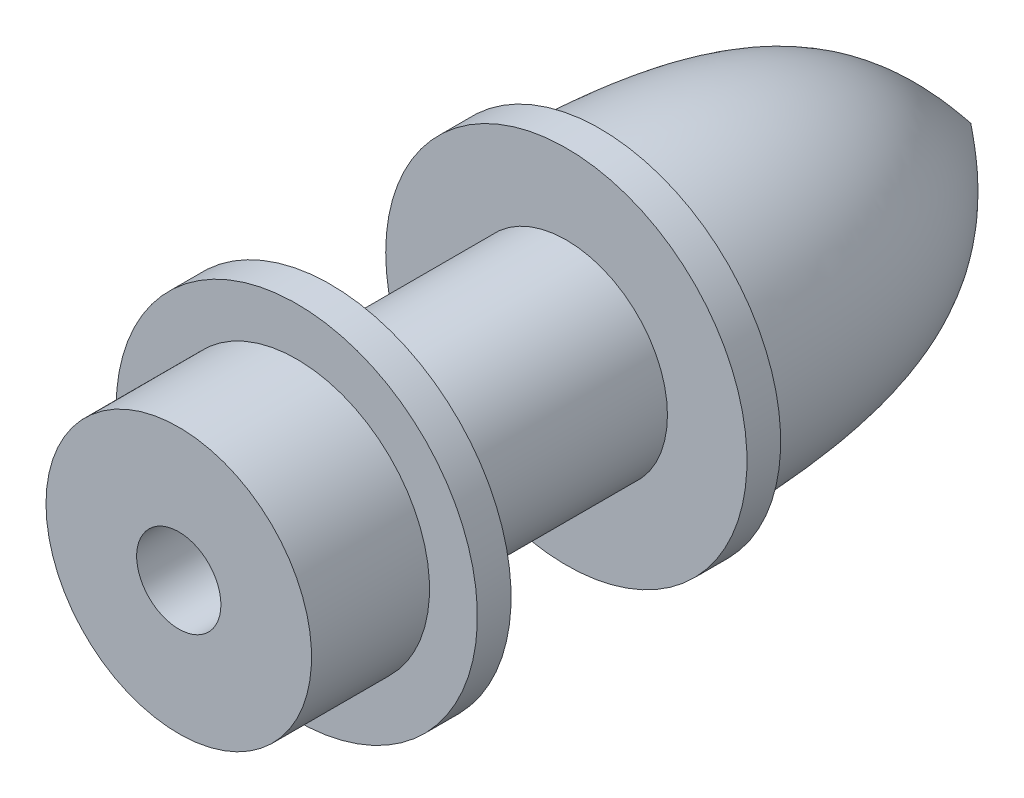
ISO-10303-21;
HEADER;
FILE_DESCRIPTION(('STEP AP214'),'2;1');
FILE_NAME('part.step','',(''),(''),'','','');
FILE_SCHEMA(('AUTOMOTIVE_DESIGN { 1 0 10303 214 1 1 1 1 }'));
ENDSEC;
DATA;
#1=APPLICATION_CONTEXT('core data for automotive mechanical design processes');
#2=APPLICATION_PROTOCOL_DEFINITION('international standard','automotive_design',2000,#1);
#3=PRODUCT_CONTEXT('',#1,'mechanical');
#4=PRODUCT('Part','Part','',(#3));
#5=PRODUCT_RELATED_PRODUCT_CATEGORY('part','',(#4));
#6=PRODUCT_DEFINITION_FORMATION('','',#4);
#7=PRODUCT_DEFINITION_CONTEXT('part definition',#1,'design');
#8=PRODUCT_DEFINITION('design','',#6,#7);
#9=PRODUCT_DEFINITION_SHAPE('','',#8);
#10=(LENGTH_UNIT() NAMED_UNIT(*) SI_UNIT(.MILLI.,.METRE.));
#11=(NAMED_UNIT(*) PLANE_ANGLE_UNIT() SI_UNIT($,.RADIAN.));
#12=(NAMED_UNIT(*) SI_UNIT($,.STERADIAN.) SOLID_ANGLE_UNIT());
#13=UNCERTAINTY_MEASURE_WITH_UNIT(LENGTH_MEASURE(1.E-05),#10,'distance_accuracy_value','');
#14=(GEOMETRIC_REPRESENTATION_CONTEXT(3) GLOBAL_UNCERTAINTY_ASSIGNED_CONTEXT((#13)) GLOBAL_UNIT_ASSIGNED_CONTEXT((#10,
#11,#12)) REPRESENTATION_CONTEXT('',''));
#15=CARTESIAN_POINT('',(0.,0.,0.));
#16=DIRECTION('',(0.,0.,1.));
#17=DIRECTION('',(1.,0.,0.));
#18=AXIS2_PLACEMENT_3D('',#15,#16,#17);
#19=CARTESIAN_POINT('',(0.,6.8072,-15.875));
#20=DIRECTION('',(0.,0.,-1.));
#21=DIRECTION('',(-1.,0.,0.));
#22=AXIS2_PLACEMENT_3D('',#19,#20,#21);
#23=PLANE('',#22);
#24=CARTESIAN_POINT('',(0.,0.,-15.875));
#25=DIRECTION('',(0.,0.,-1.));
#26=DIRECTION('',(-1.,0.,0.));
#27=AXIS2_PLACEMENT_3D('',#24,#25,#26);
#28=CIRCLE('',#27,6.8072);
#29=CARTESIAN_POINT('',(-6.8072,0.,-15.875));
#30=VERTEX_POINT('',#29);
#31=EDGE_CURVE('E67',#30,#30,#28,.T.);
#32=ORIENTED_EDGE('',*,*,#31,.T.);
#33=EDGE_LOOP('',(#32));
#34=FACE_BOUND('',#33,.T.);
#35=CARTESIAN_POINT('',(-5.96721658101854,-0.153755836887419,-15.875));
#36=CARTESIAN_POINT('',(-5.96289579852083,-0.321526685735762,-15.875));
#37=CARTESIAN_POINT('',(-5.95140440064182,-0.489084752160318,-15.875));
#38=CARTESIAN_POINT('',(-5.9143570809916,-0.822667848395895,-15.875));
#39=CARTESIAN_POINT('',(-5.88879952508088,-0.988692697805952,-15.875));
#40=CARTESIAN_POINT('',(-5.82385571254914,-1.31814541731872,-15.875));
#41=CARTESIAN_POINT('',(-5.78445865704207,-1.48157115495781,-15.875));
#42=CARTESIAN_POINT('',(-5.69207006428781,-1.80467936252946,-15.875));
#43=CARTESIAN_POINT('',(-5.63906765484769,-1.9643587267966,-15.875));
#44=CARTESIAN_POINT('',(-5.51977788420033,-2.27846783474406,-15.875));
#45=CARTESIAN_POINT('',(-5.45350604955595,-2.43290346938368,-15.875));
#46=CARTESIAN_POINT('',(-5.30802759148796,-2.7356300885722,-15.875));
#47=CARTESIAN_POINT('',(-5.22881580745373,-2.88391859186586,-15.875));
#48=CARTESIAN_POINT('',(-5.05822963133841,-3.17331395024346,-15.875));
#49=CARTESIAN_POINT('',(-4.96685569200939,-3.3144210723935,-15.875));
#50=CARTESIAN_POINT('',(-4.77262302797715,-3.58847488768774,-15.875));
#51=CARTESIAN_POINT('',(-4.66976545080016,-3.72142239414453,-15.875));
#52=CARTESIAN_POINT('',(-4.45332881031555,-3.97811952418096,-15.875));
#53=CARTESIAN_POINT('',(-4.33975784835046,-4.10187597335113,-15.875));
#54=CARTESIAN_POINT('',(-4.10249384389015,-4.33927036076112,-15.875));
#55=CARTESIAN_POINT('',(-3.97880086479062,-4.45290836236498,-15.875));
#56=CARTESIAN_POINT('',(-3.7222350454274,-4.66931341451415,-15.875));
#57=CARTESIAN_POINT('',(-3.58936212922099,-4.77208037510897,-15.875));
#58=CARTESIAN_POINT('',(-3.31551766717374,-4.96611321465578,-15.875));
#59=CARTESIAN_POINT('',(-3.1745458294947,-5.0573786787816,-15.875));
#60=CARTESIAN_POINT('',(-2.74119741259312,-5.31280267710614,-15.875));
#61=CARTESIAN_POINT('',(-2.43792569038625,-5.45897738840566,-15.875));
#62=CARTESIAN_POINT('',(-1.8109782374354,-5.69773744793128,-15.875));
#63=CARTESIAN_POINT('',(-1.48730268857581,-5.79032327378606,-15.875));
#64=CARTESIAN_POINT('',(-0.994029760162408,-5.88784516939633,-15.875));
#65=CARTESIAN_POINT('',(-0.828261239620341,-5.91346113591874,-15.875));
#66=CARTESIAN_POINT('',(-0.495128110344521,-5.95074389648107,-15.875));
#67=CARTESIAN_POINT('',(-0.327763627032272,-5.96241177769634,-15.875));
#68=CARTESIAN_POINT('',(0.00735140199715573,-5.97154132250671,-15.875));
#69=CARTESIAN_POINT('',(0.175101961660089,-5.96900246461585,-15.875));
#70=CARTESIAN_POINT('',(0.509788416865275,-5.94968246785604,-15.875));
#71=CARTESIAN_POINT('',(0.676724275052573,-5.93290068199043,-15.875));
#72=CARTESIAN_POINT('',(1.00862347175759,-5.88541189497577,-15.875));
#73=CARTESIAN_POINT('',(1.17358651673295,-5.85470284735728,-15.875));
#74=CARTESIAN_POINT('',(1.50036817080721,-5.77960573887391,-15.875));
#75=CARTESIAN_POINT('',(1.66218679768473,-5.73521775537403,-15.875));
#76=CARTESIAN_POINT('',(1.98154541094267,-5.63302945005809,-15.875));
#77=CARTESIAN_POINT('',(2.13908521841722,-5.57522856838372,-15.875));
#78=CARTESIAN_POINT('',(2.448670958548,-5.4464370385317,-15.875));
#79=CARTESIAN_POINT('',(2.60071707762953,-5.37544683842939,-15.875));
#80=CARTESIAN_POINT('',(2.89839548628963,-5.22080082654367,-15.875));
#81=CARTESIAN_POINT('',(3.04402228941393,-5.13713444162694,-15.875));
#82=CARTESIAN_POINT('',(3.32773659396731,-4.95793204213849,-15.875));
#83=CARTESIAN_POINT('',(3.46582358006957,-4.86239521771129,-15.875));
#84=CARTESIAN_POINT('',(3.86730982698097,-4.55895975396609,-15.875));
#85=CARTESIAN_POINT('',(4.11820539540708,-4.33409479653651,-15.875));
#86=CARTESIAN_POINT('',(4.57849188978899,-3.84469032731573,-15.875));
#87=CARTESIAN_POINT('',(4.7878247412859,-3.58009619650651,-15.875));
#88=CARTESIAN_POINT('',(5.06642027249764,-3.16014940013357,-15.875));
#89=CARTESIAN_POINT('',(5.15341634660334,-3.01625379125064,-15.875));
#90=CARTESIAN_POINT('',(5.31505143839337,-2.72164271248343,-15.875));
#91=CARTESIAN_POINT('',(5.38969142595162,-2.57092777905621,-15.875));
#92=CARTESIAN_POINT('',(5.52591668734646,-2.26366826560041,-15.875));
#93=CARTESIAN_POINT('',(5.5874984331237,-2.10712212350018,-15.875));
#94=CARTESIAN_POINT('',(5.69710151356774,-1.7893445515434,-15.875));
#95=CARTESIAN_POINT('',(5.74512218876544,-1.6281128942526,-15.875));
#96=CARTESIAN_POINT('',(5.82744848798242,-1.30219465984405,-15.875));
#97=CARTESIAN_POINT('',(5.86175444977901,-1.13750816791998,-15.875));
#98=CARTESIAN_POINT('',(5.91644652855323,-0.805841236274871,-15.875));
#99=CARTESIAN_POINT('',(5.93683278740134,-0.638860819951337,-15.875));
#100=CARTESIAN_POINT('',(5.9634806107231,-0.304060655241047,-15.875));
#101=CARTESIAN_POINT('',(5.96976633829961,-0.136242837356643,-15.875));
#102=CARTESIAN_POINT('',(5.96804100813675,0.19931605627198,-15.875));
#103=CARTESIAN_POINT('',(5.96003038499867,0.367057134193998,-15.875));
#104=CARTESIAN_POINT('',(5.92987857611213,0.701250953713638,-15.875));
#105=CARTESIAN_POINT('',(5.90773818300652,0.867703767049405,-15.875));
#106=CARTESIAN_POINT('',(5.84961046092335,1.1981785050913,-15.875));
#107=CARTESIAN_POINT('',(5.81362226526903,1.36220027698119,-15.875));
#108=CARTESIAN_POINT('',(5.72802639600579,1.6867118068909,-15.875));
#109=CARTESIAN_POINT('',(5.67841541553182,1.84720069709022,-15.875));
#110=CARTESIAN_POINT('',(5.56586444933595,2.16335900773255,-15.875));
#111=CARTESIAN_POINT('',(5.50292561294352,2.31902884242157,-15.875));
#112=CARTESIAN_POINT('',(5.29446439235333,2.77716606491001,-15.875));
#113=CARTESIAN_POINT('',(5.12922399036141,3.0710400174391,-15.875));
#114=CARTESIAN_POINT('',(4.84692975485146,3.48745022568908,-15.875));
#115=CARTESIAN_POINT('',(4.74713727548609,3.6221402002962,-15.875));
#116=CARTESIAN_POINT('',(4.53661076394702,3.88275253436238,-15.875));
#117=CARTESIAN_POINT('',(4.42587761591717,4.00867560089836,-15.875));
#118=CARTESIAN_POINT('',(4.19415272721611,4.25068882828351,-15.875));
#119=CARTESIAN_POINT('',(4.07316065816237,4.36677867413863,-15.875));
#120=CARTESIAN_POINT('',(3.82175997306942,4.58828544724944,-15.875));
#121=CARTESIAN_POINT('',(3.69135086816537,4.69370181973171,-15.875));
#122=CARTESIAN_POINT('',(3.42206615277858,4.89332943702219,-15.875));
#123=CARTESIAN_POINT('',(3.28318389430782,4.98753170776441,-15.875));
#124=CARTESIAN_POINT('',(2.99803224088198,5.1639959834851,-15.875));
#125=CARTESIAN_POINT('',(2.85176294303079,5.24625814536329,-15.875));
#126=CARTESIAN_POINT('',(2.55282758590366,5.39822696787289,-15.875));
#127=CARTESIAN_POINT('',(2.40016124170105,5.46793306851872,-15.875));
#128=CARTESIAN_POINT('',(2.08945042028037,5.59409244900696,-15.875));
#129=CARTESIAN_POINT('',(1.93140608488683,5.65054607802444,-15.875));
#130=CARTESIAN_POINT('',(1.61102988768835,5.74993746783144,-15.875));
#131=CARTESIAN_POINT('',(1.44869566072573,5.79286759674801,-15.875));
#132=CARTESIAN_POINT('',(1.12100040509042,5.86499714748133,-15.875));
#133=CARTESIAN_POINT('',(0.95563918792524,5.89419571118274,-15.875));
#134=CARTESIAN_POINT('',(0.623030944023366,5.93865436466095,-15.875));
#135=CARTESIAN_POINT('',(0.455783861858197,5.95391404366572,-15.875));
#136=CARTESIAN_POINT('',(0.120668783795971,5.97028451078364,-15.875));
#137=CARTESIAN_POINT('',(-0.047199158034921,5.97139650318801,-15.875));
#138=CARTESIAN_POINT('',(-0.550553477354603,5.95320174303315,-15.875));
#139=CARTESIAN_POINT('',(-0.885607358587046,5.91233963268391,-15.875));
#140=CARTESIAN_POINT('',(-1.37900281621966,5.80976567951213,-15.875));
#141=CARTESIAN_POINT('',(-1.54201083240873,5.76866546478321,-15.875));
#142=CARTESIAN_POINT('',(-1.86406109937321,5.67292915507852,-15.875));
#143=CARTESIAN_POINT('',(-2.02310367258894,5.61829416462669,-15.875));
#144=CARTESIAN_POINT('',(-2.33604385260785,5.49567983000134,-15.875));
#145=CARTESIAN_POINT('',(-2.48993863258736,5.42769329039861,-15.875));
#146=CARTESIAN_POINT('',(-2.79139631867381,5.2788715688558,-15.875));
#147=CARTESIAN_POINT('',(-2.93895886923994,5.19803566664781,-15.875));
#148=CARTESIAN_POINT('',(-3.2267635079262,5.02427199301547,-15.875));
#149=CARTESIAN_POINT('',(-3.36700612781121,4.93134510167296,-15.875));
#150=CARTESIAN_POINT('',(-3.63920888856142,4.73406789813025,-15.875));
#151=CARTESIAN_POINT('',(-3.77116919972051,4.62971782092518,-15.875));
#152=CARTESIAN_POINT('',(-4.02566867525551,4.41043601005677,-15.875));
#153=CARTESIAN_POINT('',(-4.14822075579759,4.29551927746342,-15.875));
#154=CARTESIAN_POINT('',(-4.38307972540582,4.0556565667096,-15.875));
#155=CARTESIAN_POINT('',(-4.49538679947039,3.93071076972481,-15.875));
#156=CARTESIAN_POINT('',(-4.70906634497631,3.67176105903835,-15.875));
#157=CARTESIAN_POINT('',(-4.81043675406852,3.53775544463128,-15.875));
#158=CARTESIAN_POINT('',(-5.0016037728812,3.26172743153269,-15.875));
#159=CARTESIAN_POINT('',(-5.09139993484888,3.1197047230032,-15.875));
#160=CARTESIAN_POINT('',(-5.25874487325371,2.82870241576852,-15.875));
#161=CARTESIAN_POINT('',(-5.3363002735668,2.67972663654276,-15.875));
#162=CARTESIAN_POINT('',(-5.47854863922777,2.37581290480036,-15.875));
#163=CARTESIAN_POINT('',(-5.54324170120335,2.22087499708436,-15.875));
#164=CARTESIAN_POINT('',(-5.7169983314175,1.74897348273445,-15.875));
#165=CARTESIAN_POINT('',(-5.80608783110697,1.42431675053013,-15.875));
#166=CARTESIAN_POINT('',(-5.90591015342479,0.889213718244553,-15.875));
#167=CARTESIAN_POINT('',(-5.93350484962401,0.681664684403807,-15.875));
#168=CARTESIAN_POINT('',(-5.966849951626,0.264714973667885,-15.875));
#169=CARTESIAN_POINT('',(-5.97260098964986,0.0553143505390969,-15.875));
#170=CARTESIAN_POINT('',(-5.96721658101854,-0.153755836887419,-15.875));
#171=B_SPLINE_CURVE_WITH_KNOTS('',3,(#35,#36,#37,#38,#39,#40,#41,#42,#43,#44,#45,#46,#47,#48,
#49,#50,#51,#52,#53,#54,#55,#56,#57,#58,#59,#60,#61,#62,#63,#64,#65,#66,#67,#68,#69,#70,#71,#72,
#73,#74,#75,#76,#77,#78,#79,#80,#81,#82,#83,#84,#85,#86,#87,#88,#89,#90,#91,#92,#93,#94,#95,#96,
#97,#98,#99,#100,#101,#102,#103,#104,#105,#106,#107,#108,#109,#110,#111,#112,#113,#114,#115,
#116,#117,#118,#119,#120,#121,#122,#123,#124,#125,#126,#127,#128,#129,#130,#131,#132,#133,#134,
#135,#136,#137,#138,#139,#140,#141,#142,#143,#144,#145,#146,#147,#148,#149,#150,#151,#152,#153,
#154,#155,#156,#157,#158,#159,#160,#161,#162,#163,#164,#165,#166,#167,#168,#169,#170),
.UNSPECIFIED.,.T.,.F.,(4,2,2,2,2,2,2,2,2,2,2,2,2,2,2,2,2,2,2,2,2,2,2,2,2,2,2,2,2,2,2,2,2,2,2,2,
2,2,2,2,2,2,2,2,2,2,2,2,2,2,2,2,2,2,2,2,2,2,2,2,2,2,2,2,2,2,2,4),(0.,0.503283324548454,
1.00662513051214,1.51036056696676,2.01449980413009,2.51805255912195,3.02180662961726,
3.52554195245369,4.02922698347514,4.53253414093765,5.03583814635368,5.53914631594336,
6.04247263323154,7.04733611831738,8.05219064708672,8.55491992225315,9.05761000992482,
9.56031854993397,10.0630499271122,10.565855199498,11.0686576281816,11.5714810477618,
12.0742873882487,12.5775154492679,13.0807778616695,14.0863970974199,15.0934117193223,
15.5973779536842,16.1013046111378,16.6053672458751,17.1094543887451,17.6135291157746,
18.1175987051664,18.6208038434528,19.1239936848371,19.6271553010786,20.1303484132503,
20.6336637812596,21.1369357634618,22.1426254708404,22.6450878742915,23.1475097056115,
23.6499476252594,24.1524116466503,24.6552750988251,25.158131942494,25.661011207438,
26.1638772210713,26.6670265165815,27.1702072508073,27.6734028130414,28.1765555415548,
29.1834080691524,29.6873038018852,30.1911584270537,30.6952853388886,31.1994405194071,
31.7035590238644,32.2076671596616,32.7110703681362,33.2144644846464,33.717953361901,
34.2214617109134,34.7246966539846,35.2279278163846,36.2323208736519,36.859513173465,
37.4866873203103),.UNSPECIFIED.);
#172=CARTESIAN_POINT('',(-5.96721658101854,-0.153755836887419,-15.875));
#173=VERTEX_POINT('',#172);
#174=EDGE_CURVE('E48',#173,#173,#171,.F.);
#175=ORIENTED_EDGE('',*,*,#174,.F.);
#176=EDGE_LOOP('',(#175));
#177=FACE_BOUND('',#176,.T.);
#178=ADVANCED_FACE('F44',(#34,#177),#23,.T.);
#179=CARTESIAN_POINT('',(0.,0.,0.));
#180=DIRECTION('',(0.,0.,1.));
#181=DIRECTION('',(1.,0.,0.));
#182=AXIS2_PLACEMENT_3D('',#179,#180,#181);
#183=PLANE('',#182);
#184=CARTESIAN_POINT('',(0.,0.,0.));
#185=DIRECTION('',(0.,0.,1.));
#186=DIRECTION('',(1.,0.,0.));
#187=AXIS2_PLACEMENT_3D('',#184,#185,#186);
#188=CIRCLE('',#187,1.5875);
#189=CARTESIAN_POINT('',(1.5875,0.,0.));
#190=VERTEX_POINT('',#189);
#191=EDGE_CURVE('E73',#190,#190,#188,.T.);
#192=ORIENTED_EDGE('',*,*,#191,.F.);
#193=EDGE_LOOP('',(#192));
#194=FACE_BOUND('',#193,.T.);
#195=CARTESIAN_POINT('',(0.,0.,0.));
#196=DIRECTION('',(0.,0.,-1.));
#197=DIRECTION('',(-1.,0.,0.));
#198=AXIS2_PLACEMENT_3D('',#195,#196,#197);
#199=CIRCLE('',#198,5.0038);
#200=CARTESIAN_POINT('',(-5.0038,0.,0.));
#201=VERTEX_POINT('',#200);
#202=EDGE_CURVE('E12',#201,#201,#199,.T.);
#203=ORIENTED_EDGE('',*,*,#202,.F.);
#204=EDGE_LOOP('',(#203));
#205=FACE_BOUND('',#204,.T.);
#206=ADVANCED_FACE('F46',(#194,#205),#183,.T.);
#207=CARTESIAN_POINT('',(0.,0.,0.));
#208=DIRECTION('',(0.,0.,-1.));
#209=DIRECTION('',(-1.,0.,0.));
#210=AXIS2_PLACEMENT_3D('',#207,#208,#209);
#211=CYLINDRICAL_SURFACE('',#210,5.0038);
#212=ORIENTED_EDGE('',*,*,#202,.T.);
#213=EDGE_LOOP('',(#212));
#214=FACE_BOUND('',#213,.T.);
#215=CARTESIAN_POINT('',(0.,0.,-4.445));
#216=DIRECTION('',(0.,0.,-1.));
#217=DIRECTION('',(-1.,0.,0.));
#218=AXIS2_PLACEMENT_3D('',#215,#216,#217);
#219=CIRCLE('',#218,5.0038);
#220=CARTESIAN_POINT('',(-5.0038,0.,-4.445));
#221=VERTEX_POINT('',#220);
#222=EDGE_CURVE('E56',#221,#221,#219,.T.);
#223=ORIENTED_EDGE('',*,*,#222,.F.);
#224=EDGE_LOOP('',(#223));
#225=FACE_BOUND('',#224,.T.);
#226=ADVANCED_FACE('F100',(#214,#225),#211,.T.);
#227=CARTESIAN_POINT('',(0.,5.0038,-4.445));
#228=DIRECTION('',(0.,0.,1.));
#229=DIRECTION('',(1.,0.,0.));
#230=AXIS2_PLACEMENT_3D('',#227,#228,#229);
#231=PLANE('',#230);
#232=ORIENTED_EDGE('',*,*,#222,.T.);
#233=EDGE_LOOP('',(#232));
#234=FACE_BOUND('',#233,.T.);
#235=CARTESIAN_POINT('',(0.,0.,-4.445));
#236=DIRECTION('',(0.,0.,-1.));
#237=DIRECTION('',(-1.,0.,0.));
#238=AXIS2_PLACEMENT_3D('',#235,#236,#237);
#239=CIRCLE('',#238,6.8072);
#240=CARTESIAN_POINT('',(-6.8072,0.,-4.445));
#241=VERTEX_POINT('',#240);
#242=EDGE_CURVE('E91',#241,#241,#239,.T.);
#243=ORIENTED_EDGE('',*,*,#242,.F.);
#244=EDGE_LOOP('',(#243));
#245=FACE_BOUND('',#244,.T.);
#246=ADVANCED_FACE('F97',(#234,#245),#231,.T.);
#247=CARTESIAN_POINT('',(0.,0.,0.));
#248=DIRECTION('',(0.,0.,-1.));
#249=DIRECTION('',(-1.,0.,0.));
#250=AXIS2_PLACEMENT_3D('',#247,#248,#249);
#251=CYLINDRICAL_SURFACE('',#250,6.8072);
#252=ORIENTED_EDGE('',*,*,#242,.T.);
#253=EDGE_LOOP('',(#252));
#254=FACE_BOUND('',#253,.T.);
#255=CARTESIAN_POINT('',(0.,0.,-5.715));
#256=DIRECTION('',(0.,0.,-1.));
#257=DIRECTION('',(-1.,0.,0.));
#258=AXIS2_PLACEMENT_3D('',#255,#256,#257);
#259=CIRCLE('',#258,6.8072);
#260=CARTESIAN_POINT('',(-6.8072,0.,-5.715));
#261=VERTEX_POINT('',#260);
#262=EDGE_CURVE('E88',#261,#261,#259,.T.);
#263=ORIENTED_EDGE('',*,*,#262,.F.);
#264=EDGE_LOOP('',(#263));
#265=FACE_BOUND('',#264,.T.);
#266=ADVANCED_FACE('F107',(#254,#265),#251,.T.);
#267=CARTESIAN_POINT('',(0.,6.8072,-5.715));
#268=DIRECTION('',(0.,0.,-1.));
#269=DIRECTION('',(-1.,0.,0.));
#270=AXIS2_PLACEMENT_3D('',#267,#268,#269);
#271=PLANE('',#270);
#272=ORIENTED_EDGE('',*,*,#262,.T.);
#273=EDGE_LOOP('',(#272));
#274=FACE_BOUND('',#273,.T.);
#275=CARTESIAN_POINT('',(0.,0.,-5.715));
#276=DIRECTION('',(0.,0.,-1.));
#277=DIRECTION('',(-1.,0.,0.));
#278=AXIS2_PLACEMENT_3D('',#275,#276,#277);
#279=CIRCLE('',#278,3.81);
#280=CARTESIAN_POINT('',(-3.81,0.,-5.715));
#281=VERTEX_POINT('',#280);
#282=EDGE_CURVE('E85',#281,#281,#279,.T.);
#283=ORIENTED_EDGE('',*,*,#282,.F.);
#284=EDGE_LOOP('',(#283));
#285=FACE_BOUND('',#284,.T.);
#286=ADVANCED_FACE('F130',(#274,#285),#271,.T.);
#287=CARTESIAN_POINT('',(0.,0.,0.));
#288=DIRECTION('',(0.,0.,-1.));
#289=DIRECTION('',(-1.,0.,0.));
#290=AXIS2_PLACEMENT_3D('',#287,#288,#289);
#291=CYLINDRICAL_SURFACE('',#290,3.81);
#292=ORIENTED_EDGE('',*,*,#282,.T.);
#293=EDGE_LOOP('',(#292));
#294=FACE_BOUND('',#293,.T.);
#295=CARTESIAN_POINT('',(0.,0.,-14.605));
#296=DIRECTION('',(0.,0.,-1.));
#297=DIRECTION('',(-1.,0.,0.));
#298=AXIS2_PLACEMENT_3D('',#295,#296,#297);
#299=CIRCLE('',#298,3.81);
#300=CARTESIAN_POINT('',(-3.81,0.,-14.605));
#301=VERTEX_POINT('',#300);
#302=EDGE_CURVE('E82',#301,#301,#299,.T.);
#303=ORIENTED_EDGE('',*,*,#302,.F.);
#304=EDGE_LOOP('',(#303));
#305=FACE_BOUND('',#304,.T.);
#306=ADVANCED_FACE('F126',(#294,#305),#291,.T.);
#307=CARTESIAN_POINT('',(0.,3.81,-14.605));
#308=DIRECTION('',(0.,0.,1.));
#309=DIRECTION('',(1.,0.,0.));
#310=AXIS2_PLACEMENT_3D('',#307,#308,#309);
#311=PLANE('',#310);
#312=ORIENTED_EDGE('',*,*,#302,.T.);
#313=EDGE_LOOP('',(#312));
#314=FACE_BOUND('',#313,.T.);
#315=CARTESIAN_POINT('',(0.,0.,-14.605));
#316=DIRECTION('',(0.,0.,-1.));
#317=DIRECTION('',(-1.,0.,0.));
#318=AXIS2_PLACEMENT_3D('',#315,#316,#317);
#319=CIRCLE('',#318,6.8072);
#320=CARTESIAN_POINT('',(-6.8072,0.,-14.605));
#321=VERTEX_POINT('',#320);
#322=EDGE_CURVE('E70',#321,#321,#319,.T.);
#323=ORIENTED_EDGE('',*,*,#322,.F.);
#324=EDGE_LOOP('',(#323));
#325=FACE_BOUND('',#324,.T.);
#326=ADVANCED_FACE('F122',(#314,#325),#311,.T.);
#327=CARTESIAN_POINT('',(0.,0.,0.));
#328=DIRECTION('',(0.,0.,-1.));
#329=DIRECTION('',(-1.,0.,0.));
#330=AXIS2_PLACEMENT_3D('',#327,#328,#329);
#331=CYLINDRICAL_SURFACE('',#330,6.8072);
#332=ORIENTED_EDGE('',*,*,#322,.T.);
#333=EDGE_LOOP('',(#332));
#334=FACE_BOUND('',#333,.T.);
#335=ORIENTED_EDGE('',*,*,#31,.F.);
#336=EDGE_LOOP('',(#335));
#337=FACE_BOUND('',#336,.T.);
#338=ADVANCED_FACE('F63',(#334,#337),#331,.T.);
#339=CARTESIAN_POINT('',(5.96701949922995,0.153750758728296,-15.875));
#340=CARTESIAN_POINT('',(5.81737158970207,0.0757006524149059,-19.5705600090993));
#341=CARTESIAN_POINT('',(5.59010150152154,-0.0428339438938941,-25.1830022529913));
#342=CARTESIAN_POINT('',(1.42317764220283,-0.0109050455095616,-28.6581072468475));
#343=CARTESIAN_POINT('',(0.,0.,-29.845));
#344=CARTESIAN_POINT('',(5.98714542526609,-0.627330219934897,-15.875));
#345=CARTESIAN_POINT('',(5.82728078133137,-0.685791461884088,-19.5705600090993));
#346=CARTESIAN_POINT('',(5.58449455171671,-0.774576475018268,-25.1830022529913));
#347=CARTESIAN_POINT('',(1.42175017517008,-0.197198551962292,-28.6581072468475));
#348=CARTESIAN_POINT('',(0.,0.,-29.845));
#349=CARTESIAN_POINT('',(5.71708581124115,-2.19713875788318,-15.875));
#350=CARTESIAN_POINT('',(5.54452806730064,-2.21240776073116,-19.5705600090993));
#351=CARTESIAN_POINT('',(5.28246484299422,-2.23559677576408,-25.1830022529913));
#352=CARTESIAN_POINT('',(1.34485677196123,-0.569158064014077,-28.6581072468475));
#353=CARTESIAN_POINT('',(0.,0.,-29.845));
#354=CARTESIAN_POINT('',(4.44080116807411,-4.21777387450912,-15.875));
#355=CARTESIAN_POINT('',(4.27560958486447,-4.16582743057993,-19.5705600090993));
#356=CARTESIAN_POINT('',(4.02473333940821,-4.08693643283932,-25.1830022529914));
#357=CARTESIAN_POINT('',(1.02465232570733,-1.04048854117192,-28.6581072468475));
#358=CARTESIAN_POINT('',(0.,0.,-29.845));
#359=CARTESIAN_POINT('',(2.488839979297,-5.59611630331396,-15.875));
#360=CARTESIAN_POINT('',(2.35607085201081,-5.48491045966557,-19.5705600090992));
#361=CARTESIAN_POINT('',(2.15443454876288,-5.31602228760962,-25.1830022529911));
#362=CARTESIAN_POINT('',(0.548495064097516,-1.35340012397248,-28.6581072468475));
#363=CARTESIAN_POINT('',(0.,0.,-29.845));
#364=CARTESIAN_POINT('',(0.157732050490542,-6.12259238986273,-15.875));
#365=CARTESIAN_POINT('',(0.0776508113906641,-5.96903929400452,-19.5705600090994));
#366=CARTESIAN_POINT('',(-0.0439684636747435,-5.73583840435503,-25.1830022529915));
#367=CARTESIAN_POINT('',(-0.011193881622162,-1.46028063607514,-28.6581072468476));
#368=CARTESIAN_POINT('',(0.,0.,-29.845));
#369=CARTESIAN_POINT('',(-2.19727564248725,-5.71687908812118,-15.875));
#370=CARTESIAN_POINT('',(-2.21249234204831,-5.54437440906968,-19.5705600090992));
#371=CARTESIAN_POINT('',(-2.23560192414651,-5.28239177434211,-25.1830022529911));
#372=CARTESIAN_POINT('',(-0.569159374734959,-1.34483816949542,-28.6581072468475));
#373=CARTESIAN_POINT('',(0.,0.,-29.845));
#374=CARTESIAN_POINT('',(-4.2177966718055,-4.44083889178286,-15.875));
#375=CARTESIAN_POINT('',(-4.16584852837532,-4.27564352232288,-19.5705600090994));
#376=CARTESIAN_POINT('',(-4.08695494960474,-4.02476152669308,-25.1830022529915));
#377=CARTESIAN_POINT('',(-1.04049325533437,-1.02465950187643,-28.6581072468475));
#378=CARTESIAN_POINT('',(0.,0.,-29.845));
#379=CARTESIAN_POINT('',(-5.59616931973343,-2.48872158956258,-15.875));
#380=CARTESIAN_POINT('',(-5.48492507199486,-2.35599649795183,-19.5705600090993));
#381=CARTESIAN_POINT('',(-5.31597857569642,-2.15442707162768,-25.1830022529912));
#382=CARTESIAN_POINT('',(-1.35338899540575,-0.548493160502092,-28.6581072468475));
#383=CARTESIAN_POINT('',(0.,0.,-29.845));
#384=CARTESIAN_POINT('',(-6.12255482761683,-0.157758400190099,-15.875));
#385=CARTESIAN_POINT('',(-5.9690195540344,-0.0776737998448569,-19.5705600090993));
#386=CARTESIAN_POINT('',(-5.73584573105227,0.0439505799395723,-25.1830022529913));
#387=CARTESIAN_POINT('',(-1.46028250137073,0.0111893286221767,-28.6581072468475));
#388=CARTESIAN_POINT('',(0.,0.,-29.845));
#389=CARTESIAN_POINT('',(-5.71691085591047,2.19722016899846,-15.8750000000001));
#390=CARTESIAN_POINT('',(-5.54437313166515,2.21247275746771,-19.5705600090993));
#391=CARTESIAN_POINT('',(-5.28234031124412,2.23563684400472,-25.1830022529913));
#392=CARTESIAN_POINT('',(-1.3448250675633,0.569168264942311,-28.6581072468475));
#393=CARTESIAN_POINT('',(0.,0.,-29.845));
#394=CARTESIAN_POINT('',(-4.44089999761026,4.21773233369425,-15.8749999999999));
#395=CARTESIAN_POINT('',(-4.27569551105165,4.16579488188417,-19.5705600090993));
#396=CARTESIAN_POINT('',(-4.02479966929586,4.0869175404633,-25.1830022529914));
#397=CARTESIAN_POINT('',(-1.02466921255869,1.0404837313832,-28.6581072468475));
#398=CARTESIAN_POINT('',(0.,0.,-29.845));
#399=CARTESIAN_POINT('',(-2.48877535341987,5.59613473725166,-15.875));
#400=CARTESIAN_POINT('',(-2.35601497976274,5.48492469120552,-19.5705600090993));
#401=CARTESIAN_POINT('',(-2.15439197064004,5.31603013697351,-25.1830022529913));
#402=CARTESIAN_POINT('',(-0.5484842241812,1.35340212233318,-28.6581072468475));
#403=CARTESIAN_POINT('',(0.,0.,-29.845));
#404=CARTESIAN_POINT('',(-0.157786649354811,6.12259098302691,-15.875));
#405=CARTESIAN_POINT('',(-0.0776978552798222,5.96903857671681,-19.5705600090993));
#406=CARTESIAN_POINT('',(0.0439328935165929,5.73583873428315,-25.1830022529914));
#407=CARTESIAN_POINT('',(0.0111848258556798,1.46028072007117,-28.6581072468475));
#408=CARTESIAN_POINT('',(0.,0.,-29.845));
#409=CARTESIAN_POINT('',(2.19734113194313,5.71686400683402,-15.875));
#410=CARTESIAN_POINT('',(2.21254866305154,5.54436188658082,-19.5705600090993));
#411=CARTESIAN_POINT('',(2.23564432103245,5.28238313789694,-25.1830022529912));
#412=CARTESIAN_POINT('',(0.569170168510376,1.34483597075258,-28.6581072468475));
#413=CARTESIAN_POINT('',(0.,0.,-29.845));
#414=CARTESIAN_POINT('',(4.2176958340892,4.44087528781956,-15.875));
#415=CARTESIAN_POINT('',(4.16576155969402,4.27567345131494,-19.5705600090993));
#416=CARTESIAN_POINT('',(4.08688904380909,4.02478163419273,-25.1830022529914));
#417=CARTESIAN_POINT('',(1.04047647645212,1.02466462102211,-28.6581072468475));
#418=CARTESIAN_POINT('',(0.,0.,-29.845));
#419=CARTESIAN_POINT('',(5.59634823552121,2.48864929655946,-15.875));
#420=CARTESIAN_POINT('',(5.48508205501596,2.35593612225209,-19.5705600090993));
#421=CARTESIAN_POINT('',(5.31610224945291,2.15438479472129,-25.1830022529913));
#422=CARTESIAN_POINT('',(1.35342048136806,0.548482397272134,-28.6581072468475));
#423=CARTESIAN_POINT('',(0.,0.,-29.845));
#424=CARTESIAN_POINT('',(5.94689357319381,0.934831737391489,-15.875));
#425=CARTESIAN_POINT('',(5.80746239807276,0.8371927667139,-19.5705600090993));
#426=CARTESIAN_POINT('',(5.59570845132637,0.68890858723048,-25.1830022529913));
#427=CARTESIAN_POINT('',(1.42460510923559,0.175388460943169,-28.6581072468475));
#428=CARTESIAN_POINT('',(0.,0.,-29.845));
#429=CARTESIAN_POINT('',(5.96701949922995,0.153750758728296,-15.875));
#430=CARTESIAN_POINT('',(5.81737158970207,0.0757006524149059,-19.5705600090993));
#431=CARTESIAN_POINT('',(5.59010150152154,-0.0428339438938941,-25.1830022529913));
#432=CARTESIAN_POINT('',(1.42317764220283,-0.0109050455095616,-28.6581072468475));
#433=CARTESIAN_POINT('',(0.,0.,-29.845));
#434=B_SPLINE_SURFACE_WITH_KNOTS('',3,3,((#339,#340,#341,#342,#343),(#344,#345,#346,#347,#348),
(#349,#350,#351,#352,#353),(#354,#355,#356,#357,#358),(#359,#360,#361,#362,#363),(#364,#365,
#366,#367,#368),(#369,#370,#371,#372,#373),(#374,#375,#376,#377,#378),(#379,#380,#381,#382,
#383),(#384,#385,#386,#387,#388),(#389,#390,#391,#392,#393),(#394,#395,#396,#397,#398),(#399,
#400,#401,#402,#403),(#404,#405,#406,#407,#408),(#409,#410,#411,#412,#413),(#414,#415,#416,#417,
#418),(#419,#420,#421,#422,#423),(#424,#425,#426,#427,#428),(#429,#430,#431,#432,#433)),
.UNSPECIFIED.,.T.,.F.,.F.,(4,1,1,1,1,1,1,1,1,1,1,1,1,1,1,1,4),(4,1,4),(0.,0.0625,0.125,0.1875,
0.25,0.3125,0.375,0.4375,0.5,0.5625,0.625,0.6875,0.75,0.8125,0.875,0.9375,1.),(0.,
0.658458447945933,1.),.UNSPECIFIED.);
#435=CARTESIAN_POINT('',(0.,0.,-29.845));
#436=VERTEX_POINT('',#435);
#437=VERTEX_LOOP('',#436);
#438=FACE_BOUND('',#437,.T.);
#439=ORIENTED_EDGE('',*,*,#174,.T.);
#440=EDGE_LOOP('',(#439));
#441=FACE_BOUND('',#440,.T.);
#442=ADVANCED_FACE('F59',(#438,#441),#434,.T.);
#443=CARTESIAN_POINT('',(0.,0.,-10.16));
#444=DIRECTION('',(0.,0.,1.));
#445=DIRECTION('',(1.,0.,0.));
#446=AXIS2_PLACEMENT_3D('',#443,#444,#445);
#447=CYLINDRICAL_SURFACE('',#446,1.5875);
#448=CARTESIAN_POINT('',(0.,0.,-10.16));
#449=DIRECTION('',(0.,0.,1.));
#450=DIRECTION('',(1.,0.,0.));
#451=AXIS2_PLACEMENT_3D('',#448,#449,#450);
#452=CIRCLE('',#451,1.5875);
#453=CARTESIAN_POINT('',(1.5875,0.,-10.16));
#454=VERTEX_POINT('',#453);
#455=EDGE_CURVE('E68',#454,#454,#452,.T.);
#456=ORIENTED_EDGE('',*,*,#455,.F.);
#457=EDGE_LOOP('',(#456));
#458=FACE_BOUND('',#457,.T.);
#459=ORIENTED_EDGE('',*,*,#191,.T.);
#460=EDGE_LOOP('',(#459));
#461=FACE_BOUND('',#460,.T.);
#462=ADVANCED_FACE('F62',(#458,#461),#447,.F.);
#463=CARTESIAN_POINT('',(0.,0.,-10.16));
#464=DIRECTION('',(0.,0.,1.));
#465=DIRECTION('',(1.,0.,0.));
#466=AXIS2_PLACEMENT_3D('',#463,#464,#465);
#467=PLANE('',#466);
#468=ORIENTED_EDGE('',*,*,#455,.T.);
#469=EDGE_LOOP('',(#468));
#470=FACE_BOUND('',#469,.T.);
#471=ADVANCED_FACE('F179',(#470),#467,.T.);
#472=CLOSED_SHELL('',(#178,#206,#226,#246,#266,#286,#306,#326,#338,#442,#462,#471));
#473=MANIFOLD_SOLID_BREP('B2',#472);
#474=ADVANCED_BREP_SHAPE_REPRESENTATION('',(#18,#473),#14);
#475=SHAPE_DEFINITION_REPRESENTATION(#9,#474);
ENDSEC;
END-ISO-10303-21;
